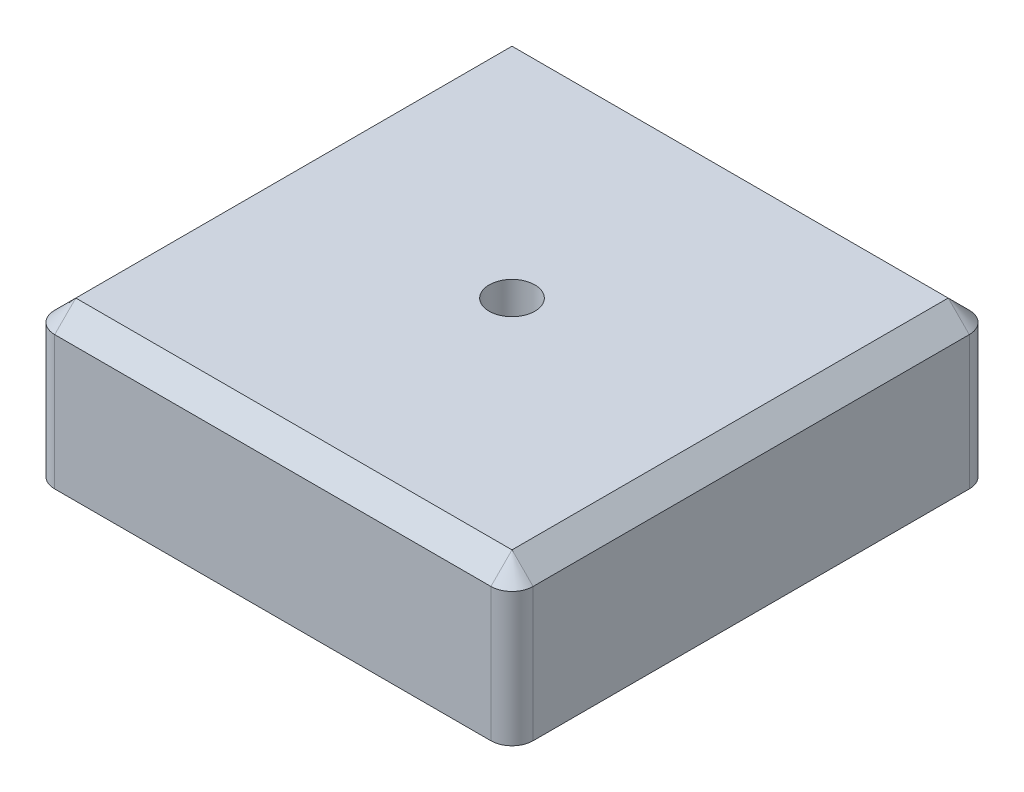
ISO-10303-21;
HEADER;
FILE_DESCRIPTION(('STEP AP214'),'2;1');
FILE_NAME('part.step','',(''),(''),'','','');
FILE_SCHEMA(('AUTOMOTIVE_DESIGN { 1 0 10303 214 1 1 1 1 }'));
ENDSEC;
DATA;
#1=APPLICATION_CONTEXT('core data for automotive mechanical design processes');
#2=APPLICATION_PROTOCOL_DEFINITION('international standard','automotive_design',2000,#1);
#3=PRODUCT_CONTEXT('',#1,'mechanical');
#4=PRODUCT('Part','Part','',(#3));
#5=PRODUCT_RELATED_PRODUCT_CATEGORY('part','',(#4));
#6=PRODUCT_DEFINITION_FORMATION('','',#4);
#7=PRODUCT_DEFINITION_CONTEXT('part definition',#1,'design');
#8=PRODUCT_DEFINITION('design','',#6,#7);
#9=PRODUCT_DEFINITION_SHAPE('','',#8);
#10=(LENGTH_UNIT() NAMED_UNIT(*) SI_UNIT(.MILLI.,.METRE.));
#11=(NAMED_UNIT(*) PLANE_ANGLE_UNIT() SI_UNIT($,.RADIAN.));
#12=(NAMED_UNIT(*) SI_UNIT($,.STERADIAN.) SOLID_ANGLE_UNIT());
#13=UNCERTAINTY_MEASURE_WITH_UNIT(LENGTH_MEASURE(1.E-05),#10,'distance_accuracy_value','');
#14=(GEOMETRIC_REPRESENTATION_CONTEXT(3) GLOBAL_UNCERTAINTY_ASSIGNED_CONTEXT((#13)) GLOBAL_UNIT_ASSIGNED_CONTEXT((#10,
#11,#12)) REPRESENTATION_CONTEXT('',''));
#15=CARTESIAN_POINT('',(0.,0.,0.));
#16=DIRECTION('',(0.,0.,1.));
#17=DIRECTION('',(1.,0.,0.));
#18=AXIS2_PLACEMENT_3D('',#15,#16,#17);
#19=CARTESIAN_POINT('',(34.,10.,-34.));
#20=DIRECTION('',(-1.,0.,0.));
#21=DIRECTION('',(0.,0.,1.));
#22=AXIS2_PLACEMENT_3D('',#19,#20,#21);
#23=PLANE('',#22);
#24=DIRECTION('',(0.,-1.,0.));
#25=VECTOR('',#24,1.);
#26=CARTESIAN_POINT('',(34.,10.,-31.));
#27=LINE('',#26,#25);
#28=CARTESIAN_POINT('',(34.,-12.,-31.));
#29=VERTEX_POINT('',#28);
#30=CARTESIAN_POINT('',(34.,6.99999999999998,-31.));
#31=VERTEX_POINT('',#30);
#32=EDGE_CURVE('E188',#29,#31,#27,.F.);
#33=ORIENTED_EDGE('',*,*,#32,.T.);
#34=DIRECTION('',(0.,0.,1.));
#35=VECTOR('',#34,1.);
#36=CARTESIAN_POINT('',(34.,6.99999999999998,31.));
#37=LINE('',#36,#35);
#38=CARTESIAN_POINT('',(34.,6.99999999999998,31.));
#39=VERTEX_POINT('',#38);
#40=EDGE_CURVE('E260',#31,#39,#37,.T.);
#41=ORIENTED_EDGE('',*,*,#40,.T.);
#42=DIRECTION('',(0.,-1.,0.));
#43=VECTOR('',#42,1.);
#44=CARTESIAN_POINT('',(34.,10.,31.));
#45=LINE('',#44,#43);
#46=CARTESIAN_POINT('',(34.,-12.,31.));
#47=VERTEX_POINT('',#46);
#48=EDGE_CURVE('E190',#39,#47,#45,.T.);
#49=ORIENTED_EDGE('',*,*,#48,.T.);
#50=DIRECTION('',(0.,0.,1.));
#51=VECTOR('',#50,1.);
#52=CARTESIAN_POINT('',(34.,-12.,-34.));
#53=LINE('',#52,#51);
#54=EDGE_CURVE('E177',#29,#47,#53,.T.);
#55=ORIENTED_EDGE('',*,*,#54,.F.);
#56=EDGE_LOOP('',(#33,#41,#49,#55));
#57=FACE_BOUND('',#56,.T.);
#58=ADVANCED_FACE('F34',(#57),#23,.F.);
#59=CARTESIAN_POINT('',(-34.,10.,-34.));
#60=DIRECTION('',(0.,0.,1.));
#61=DIRECTION('',(1.,0.,0.));
#62=AXIS2_PLACEMENT_3D('',#59,#60,#61);
#63=PLANE('',#62);
#64=DIRECTION('',(0.,-1.,0.));
#65=VECTOR('',#64,1.);
#66=CARTESIAN_POINT('',(-31.,10.,-34.));
#67=LINE('',#66,#65);
#68=CARTESIAN_POINT('',(-31.,-12.,-34.));
#69=VERTEX_POINT('',#68);
#70=CARTESIAN_POINT('',(-31.,6.99999999999998,-34.));
#71=VERTEX_POINT('',#70);
#72=EDGE_CURVE('E219',#69,#71,#67,.F.);
#73=ORIENTED_EDGE('',*,*,#72,.T.);
#74=DIRECTION('',(1.,0.,0.));
#75=VECTOR('',#74,1.);
#76=CARTESIAN_POINT('',(31.,6.99999999999998,-34.));
#77=LINE('',#76,#75);
#78=CARTESIAN_POINT('',(31.,6.99999999999998,-34.));
#79=VERTEX_POINT('',#78);
#80=EDGE_CURVE('E264',#71,#79,#77,.T.);
#81=ORIENTED_EDGE('',*,*,#80,.T.);
#82=DIRECTION('',(0.,-1.,0.));
#83=VECTOR('',#82,1.);
#84=CARTESIAN_POINT('',(31.,10.,-34.));
#85=LINE('',#84,#83);
#86=CARTESIAN_POINT('',(31.,-12.,-34.));
#87=VERTEX_POINT('',#86);
#88=EDGE_CURVE('E222',#79,#87,#85,.T.);
#89=ORIENTED_EDGE('',*,*,#88,.T.);
#90=DIRECTION('',(1.,0.,0.));
#91=VECTOR('',#90,1.);
#92=CARTESIAN_POINT('',(-34.,-12.,-34.));
#93=LINE('',#92,#91);
#94=EDGE_CURVE('E179',#69,#87,#93,.T.);
#95=ORIENTED_EDGE('',*,*,#94,.F.);
#96=EDGE_LOOP('',(#73,#81,#89,#95));
#97=FACE_BOUND('',#96,.T.);
#98=ADVANCED_FACE('F427',(#97),#63,.F.);
#99=CARTESIAN_POINT('',(-34.,10.,-34.));
#100=DIRECTION('',(1.,0.,0.));
#101=DIRECTION('',(0.,0.,-1.));
#102=AXIS2_PLACEMENT_3D('',#99,#100,#101);
#103=PLANE('',#102);
#104=DIRECTION('',(0.,-1.,0.));
#105=VECTOR('',#104,1.);
#106=CARTESIAN_POINT('',(-34.,10.,31.));
#107=LINE('',#106,#105);
#108=CARTESIAN_POINT('',(-34.,-12.,31.));
#109=VERTEX_POINT('',#108);
#110=CARTESIAN_POINT('',(-34.,6.99999999999998,31.));
#111=VERTEX_POINT('',#110);
#112=EDGE_CURVE('E216',#109,#111,#107,.F.);
#113=ORIENTED_EDGE('',*,*,#112,.T.);
#114=DIRECTION('',(0.,0.,-1.));
#115=VECTOR('',#114,1.);
#116=CARTESIAN_POINT('',(-34.,6.99999999999998,-31.));
#117=LINE('',#116,#115);
#118=CARTESIAN_POINT('',(-34.,6.99999999999998,-31.));
#119=VERTEX_POINT('',#118);
#120=EDGE_CURVE('E268',#111,#119,#117,.T.);
#121=ORIENTED_EDGE('',*,*,#120,.T.);
#122=DIRECTION('',(0.,-1.,0.));
#123=VECTOR('',#122,1.);
#124=CARTESIAN_POINT('',(-34.,10.,-31.));
#125=LINE('',#124,#123);
#126=CARTESIAN_POINT('',(-34.,-12.,-31.));
#127=VERTEX_POINT('',#126);
#128=EDGE_CURVE('E214',#119,#127,#125,.T.);
#129=ORIENTED_EDGE('',*,*,#128,.T.);
#130=DIRECTION('',(0.,0.,-1.));
#131=VECTOR('',#130,1.);
#132=CARTESIAN_POINT('',(-34.,-12.,34.));
#133=LINE('',#132,#131);
#134=EDGE_CURVE('E198',#109,#127,#133,.T.);
#135=ORIENTED_EDGE('',*,*,#134,.F.);
#136=EDGE_LOOP('',(#113,#121,#129,#135));
#137=FACE_BOUND('',#136,.T.);
#138=ADVANCED_FACE('F421',(#137),#103,.F.);
#139=CARTESIAN_POINT('',(-34.,10.,34.));
#140=DIRECTION('',(0.,0.,-1.));
#141=DIRECTION('',(-1.,0.,0.));
#142=AXIS2_PLACEMENT_3D('',#139,#140,#141);
#143=PLANE('',#142);
#144=DIRECTION('',(0.,-1.,0.));
#145=VECTOR('',#144,1.);
#146=CARTESIAN_POINT('',(31.,10.,34.));
#147=LINE('',#146,#145);
#148=CARTESIAN_POINT('',(31.,-12.,34.));
#149=VERTEX_POINT('',#148);
#150=CARTESIAN_POINT('',(31.,6.99999999999998,34.));
#151=VERTEX_POINT('',#150);
#152=EDGE_CURVE('E211',#149,#151,#147,.F.);
#153=ORIENTED_EDGE('',*,*,#152,.T.);
#154=DIRECTION('',(-1.,0.,0.));
#155=VECTOR('',#154,1.);
#156=CARTESIAN_POINT('',(-31.,6.99999999999998,34.));
#157=LINE('',#156,#155);
#158=CARTESIAN_POINT('',(-31.,6.99999999999998,34.));
#159=VERTEX_POINT('',#158);
#160=EDGE_CURVE('E272',#151,#159,#157,.T.);
#161=ORIENTED_EDGE('',*,*,#160,.T.);
#162=DIRECTION('',(0.,-1.,0.));
#163=VECTOR('',#162,1.);
#164=CARTESIAN_POINT('',(-31.,10.,34.));
#165=LINE('',#164,#163);
#166=CARTESIAN_POINT('',(-31.,-12.,34.));
#167=VERTEX_POINT('',#166);
#168=EDGE_CURVE('E209',#159,#167,#165,.T.);
#169=ORIENTED_EDGE('',*,*,#168,.T.);
#170=DIRECTION('',(-1.,0.,0.));
#171=VECTOR('',#170,1.);
#172=CARTESIAN_POINT('',(34.,-12.,34.));
#173=LINE('',#172,#171);
#174=EDGE_CURVE('E192',#149,#167,#173,.T.);
#175=ORIENTED_EDGE('',*,*,#174,.F.);
#176=EDGE_LOOP('',(#153,#161,#169,#175));
#177=FACE_BOUND('',#176,.T.);
#178=ADVANCED_FACE('F383',(#177),#143,.F.);
#179=CARTESIAN_POINT('',(0.,10.,0.));
#180=DIRECTION('',(0.,1.,0.));
#181=DIRECTION('',(0.,0.,1.));
#182=AXIS2_PLACEMENT_3D('',#179,#180,#181);
#183=PLANE('',#182);
#184=DIRECTION('',(1.,0.,0.));
#185=VECTOR('',#184,1.);
#186=CARTESIAN_POINT('',(31.,10.,31.));
#187=LINE('',#186,#185);
#188=CARTESIAN_POINT('',(-31.,10.,31.));
#189=VERTEX_POINT('',#188);
#190=CARTESIAN_POINT('',(31.,10.,31.));
#191=VERTEX_POINT('',#190);
#192=EDGE_CURVE('E251',#189,#191,#187,.T.);
#193=ORIENTED_EDGE('',*,*,#192,.T.);
#194=DIRECTION('',(0.,0.,-1.));
#195=VECTOR('',#194,1.);
#196=CARTESIAN_POINT('',(31.,10.,-31.));
#197=LINE('',#196,#195);
#198=CARTESIAN_POINT('',(31.,10.,-31.));
#199=VERTEX_POINT('',#198);
#200=EDGE_CURVE('E257',#191,#199,#197,.T.);
#201=ORIENTED_EDGE('',*,*,#200,.T.);
#202=DIRECTION('',(-1.,0.,0.));
#203=VECTOR('',#202,1.);
#204=CARTESIAN_POINT('',(-31.,10.,-31.));
#205=LINE('',#204,#203);
#206=CARTESIAN_POINT('',(-31.,10.,-31.));
#207=VERTEX_POINT('',#206);
#208=EDGE_CURVE('E255',#199,#207,#205,.T.);
#209=ORIENTED_EDGE('',*,*,#208,.T.);
#210=DIRECTION('',(0.,0.,1.));
#211=VECTOR('',#210,1.);
#212=CARTESIAN_POINT('',(-31.,10.,31.));
#213=LINE('',#212,#211);
#214=EDGE_CURVE('E253',#207,#189,#213,.T.);
#215=ORIENTED_EDGE('',*,*,#214,.T.);
#216=EDGE_LOOP('',(#193,#201,#209,#215));
#217=FACE_BOUND('',#216,.T.);
#218=CARTESIAN_POINT('',(0.,10.,0.));
#219=DIRECTION('',(0.,1.,0.));
#220=DIRECTION('',(0.,0.,1.));
#221=AXIS2_PLACEMENT_3D('',#218,#219,#220);
#222=CIRCLE('',#221,3.25);
#223=CARTESIAN_POINT('',(0.,10.,3.25));
#224=VERTEX_POINT('',#223);
#225=EDGE_CURVE('E763',#224,#224,#222,.T.);
#226=ORIENTED_EDGE('',*,*,#225,.F.);
#227=EDGE_LOOP('',(#226));
#228=FACE_BOUND('',#227,.T.);
#229=ADVANCED_FACE('F400',(#217,#228),#183,.T.);
#230=CARTESIAN_POINT('',(0.,-12.,0.));
#231=DIRECTION('',(0.,-1.,0.));
#232=DIRECTION('',(0.,0.,-1.));
#233=AXIS2_PLACEMENT_3D('',#230,#231,#232);
#234=PLANE('',#233);
#235=ORIENTED_EDGE('',*,*,#54,.T.);
#236=CARTESIAN_POINT('',(31.,-12.,31.));
#237=DIRECTION('',(0.,-1.,0.));
#238=DIRECTION('',(0.,0.,-1.));
#239=AXIS2_PLACEMENT_3D('',#236,#237,#238);
#240=CIRCLE('',#239,3.);
#241=EDGE_CURVE('E207',#47,#149,#240,.T.);
#242=ORIENTED_EDGE('',*,*,#241,.T.);
#243=ORIENTED_EDGE('',*,*,#174,.T.);
#244=CARTESIAN_POINT('',(-31.,-12.,31.));
#245=DIRECTION('',(0.,-1.,0.));
#246=DIRECTION('',(0.,0.,-1.));
#247=AXIS2_PLACEMENT_3D('',#244,#245,#246);
#248=CIRCLE('',#247,3.);
#249=EDGE_CURVE('E183',#167,#109,#248,.T.);
#250=ORIENTED_EDGE('',*,*,#249,.T.);
#251=ORIENTED_EDGE('',*,*,#134,.T.);
#252=CARTESIAN_POINT('',(-31.,-12.,-31.));
#253=DIRECTION('',(0.,-1.,0.));
#254=DIRECTION('',(0.,0.,-1.));
#255=AXIS2_PLACEMENT_3D('',#252,#253,#254);
#256=CIRCLE('',#255,3.);
#257=EDGE_CURVE('E184',#127,#69,#256,.T.);
#258=ORIENTED_EDGE('',*,*,#257,.T.);
#259=ORIENTED_EDGE('',*,*,#94,.T.);
#260=CARTESIAN_POINT('',(31.,-12.,-31.));
#261=DIRECTION('',(0.,-1.,0.));
#262=DIRECTION('',(0.,0.,-1.));
#263=AXIS2_PLACEMENT_3D('',#260,#261,#262);
#264=CIRCLE('',#263,3.);
#265=EDGE_CURVE('E173',#87,#29,#264,.T.);
#266=ORIENTED_EDGE('',*,*,#265,.T.);
#267=EDGE_LOOP('',(#235,#242,#243,#250,#251,#258,#259,#266));
#268=FACE_BOUND('',#267,.T.);
#269=DIRECTION('',(-1.,0.,0.));
#270=VECTOR('',#269,1.);
#271=CARTESIAN_POINT('',(-15.,-12.,15.));
#272=LINE('',#271,#270);
#273=CARTESIAN_POINT('',(12.,-12.,15.));
#274=VERTEX_POINT('',#273);
#275=CARTESIAN_POINT('',(-12.,-12.,15.));
#276=VERTEX_POINT('',#275);
#277=EDGE_CURVE('E374',#274,#276,#272,.T.);
#278=ORIENTED_EDGE('',*,*,#277,.F.);
#279=CARTESIAN_POINT('',(12.,-12.,12.));
#280=DIRECTION('',(0.,-1.,0.));
#281=DIRECTION('',(0.,0.,-1.));
#282=AXIS2_PLACEMENT_3D('',#279,#280,#281);
#283=CIRCLE('',#282,3.);
#284=CARTESIAN_POINT('',(15.,-12.,12.));
#285=VERTEX_POINT('',#284);
#286=EDGE_CURVE('E248',#274,#285,#283,.F.);
#287=ORIENTED_EDGE('',*,*,#286,.T.);
#288=DIRECTION('',(0.,0.,1.));
#289=VECTOR('',#288,1.);
#290=CARTESIAN_POINT('',(15.,-12.,15.));
#291=LINE('',#290,#289);
#292=CARTESIAN_POINT('',(15.,-12.,-12.));
#293=VERTEX_POINT('',#292);
#294=EDGE_CURVE('E365',#293,#285,#291,.T.);
#295=ORIENTED_EDGE('',*,*,#294,.F.);
#296=CARTESIAN_POINT('',(12.,-12.,-12.));
#297=DIRECTION('',(0.,-1.,0.));
#298=DIRECTION('',(0.,0.,-1.));
#299=AXIS2_PLACEMENT_3D('',#296,#297,#298);
#300=CIRCLE('',#299,3.);
#301=CARTESIAN_POINT('',(12.,-12.,-15.));
#302=VERTEX_POINT('',#301);
#303=EDGE_CURVE('E246',#293,#302,#300,.F.);
#304=ORIENTED_EDGE('',*,*,#303,.T.);
#305=DIRECTION('',(1.,0.,0.));
#306=VECTOR('',#305,1.);
#307=CARTESIAN_POINT('',(-15.,-12.,-15.));
#308=LINE('',#307,#306);
#309=CARTESIAN_POINT('',(-12.,-12.,-15.));
#310=VERTEX_POINT('',#309);
#311=EDGE_CURVE('E363',#310,#302,#308,.T.);
#312=ORIENTED_EDGE('',*,*,#311,.F.);
#313=CARTESIAN_POINT('',(-12.,-12.,-12.));
#314=DIRECTION('',(0.,-1.,0.));
#315=DIRECTION('',(0.,0.,-1.));
#316=AXIS2_PLACEMENT_3D('',#313,#314,#315);
#317=CIRCLE('',#316,3.);
#318=CARTESIAN_POINT('',(-15.,-12.,-12.));
#319=VERTEX_POINT('',#318);
#320=EDGE_CURVE('E244',#310,#319,#317,.F.);
#321=ORIENTED_EDGE('',*,*,#320,.T.);
#322=DIRECTION('',(0.,0.,-1.));
#323=VECTOR('',#322,1.);
#324=CARTESIAN_POINT('',(-15.,-12.,15.));
#325=LINE('',#324,#323);
#326=CARTESIAN_POINT('',(-15.,-12.,12.));
#327=VERTEX_POINT('',#326);
#328=EDGE_CURVE('E370',#327,#319,#325,.T.);
#329=ORIENTED_EDGE('',*,*,#328,.F.);
#330=CARTESIAN_POINT('',(-12.,-12.,12.));
#331=DIRECTION('',(0.,-1.,0.));
#332=DIRECTION('',(0.,0.,-1.));
#333=AXIS2_PLACEMENT_3D('',#330,#331,#332);
#334=CIRCLE('',#333,3.);
#335=EDGE_CURVE('E242',#327,#276,#334,.F.);
#336=ORIENTED_EDGE('',*,*,#335,.T.);
#337=EDGE_LOOP('',(#278,#287,#295,#304,#312,#321,#329,#336));
#338=FACE_BOUND('',#337,.T.);
#339=ADVANCED_FACE('F175',(#268,#338),#234,.T.);
#340=CARTESIAN_POINT('',(15.,-12.,15.));
#341=DIRECTION('',(-1.,0.,0.));
#342=DIRECTION('',(0.,0.,1.));
#343=AXIS2_PLACEMENT_3D('',#340,#341,#342);
#344=PLANE('',#343);
#345=DIRECTION('',(0.,1.,0.));
#346=VECTOR('',#345,1.);
#347=CARTESIAN_POINT('',(15.,0.,12.));
#348=LINE('',#347,#346);
#349=CARTESIAN_POINT('',(15.,-2.99999999999998,12.));
#350=VERTEX_POINT('',#349);
#351=EDGE_CURVE('E238',#285,#350,#348,.T.);
#352=ORIENTED_EDGE('',*,*,#351,.T.);
#353=DIRECTION('',(0.,0.,-1.));
#354=VECTOR('',#353,1.);
#355=CARTESIAN_POINT('',(15.,-2.99999999999998,15.));
#356=LINE('',#355,#354);
#357=CARTESIAN_POINT('',(15.,-2.99999999999998,-12.));
#358=VERTEX_POINT('',#357);
#359=EDGE_CURVE('E317',#350,#358,#356,.T.);
#360=ORIENTED_EDGE('',*,*,#359,.T.);
#361=DIRECTION('',(0.,1.,0.));
#362=VECTOR('',#361,1.);
#363=CARTESIAN_POINT('',(15.,-12.,-12.));
#364=LINE('',#363,#362);
#365=EDGE_CURVE('E240',#358,#293,#364,.F.);
#366=ORIENTED_EDGE('',*,*,#365,.T.);
#367=ORIENTED_EDGE('',*,*,#294,.T.);
#368=EDGE_LOOP('',(#352,#360,#366,#367));
#369=FACE_BOUND('',#368,.T.);
#370=ADVANCED_FACE('F353',(#369),#344,.T.);
#371=CARTESIAN_POINT('',(-15.,-12.,15.));
#372=DIRECTION('',(0.,0.,-1.));
#373=DIRECTION('',(-1.,0.,0.));
#374=AXIS2_PLACEMENT_3D('',#371,#372,#373);
#375=PLANE('',#374);
#376=DIRECTION('',(0.,1.,0.));
#377=VECTOR('',#376,1.);
#378=CARTESIAN_POINT('',(-12.,0.,15.));
#379=LINE('',#378,#377);
#380=CARTESIAN_POINT('',(-12.,-2.99999999999998,15.));
#381=VERTEX_POINT('',#380);
#382=EDGE_CURVE('E226',#276,#381,#379,.T.);
#383=ORIENTED_EDGE('',*,*,#382,.T.);
#384=DIRECTION('',(1.,0.,0.));
#385=VECTOR('',#384,1.);
#386=CARTESIAN_POINT('',(-15.,-2.99999999999998,15.));
#387=LINE('',#386,#385);
#388=CARTESIAN_POINT('',(12.,-2.99999999999998,15.));
#389=VERTEX_POINT('',#388);
#390=EDGE_CURVE('E43',#381,#389,#387,.T.);
#391=ORIENTED_EDGE('',*,*,#390,.T.);
#392=DIRECTION('',(0.,1.,0.));
#393=VECTOR('',#392,1.);
#394=CARTESIAN_POINT('',(12.,-12.,15.));
#395=LINE('',#394,#393);
#396=EDGE_CURVE('E224',#389,#274,#395,.F.);
#397=ORIENTED_EDGE('',*,*,#396,.T.);
#398=ORIENTED_EDGE('',*,*,#277,.T.);
#399=EDGE_LOOP('',(#383,#391,#397,#398));
#400=FACE_BOUND('',#399,.T.);
#401=ADVANCED_FACE('F665',(#400),#375,.T.);
#402=CARTESIAN_POINT('',(-15.,-12.,15.));
#403=DIRECTION('',(1.,0.,0.));
#404=DIRECTION('',(0.,0.,-1.));
#405=AXIS2_PLACEMENT_3D('',#402,#403,#404);
#406=PLANE('',#405);
#407=DIRECTION('',(0.,1.,0.));
#408=VECTOR('',#407,1.);
#409=CARTESIAN_POINT('',(-15.,0.,-12.));
#410=LINE('',#409,#408);
#411=CARTESIAN_POINT('',(-15.,-2.99999999999998,-12.));
#412=VERTEX_POINT('',#411);
#413=EDGE_CURVE('E228',#319,#412,#410,.T.);
#414=ORIENTED_EDGE('',*,*,#413,.T.);
#415=DIRECTION('',(0.,0.,1.));
#416=VECTOR('',#415,1.);
#417=CARTESIAN_POINT('',(-15.,-2.99999999999998,15.));
#418=LINE('',#417,#416);
#419=CARTESIAN_POINT('',(-15.,-2.99999999999998,12.));
#420=VERTEX_POINT('',#419);
#421=EDGE_CURVE('E311',#412,#420,#418,.T.);
#422=ORIENTED_EDGE('',*,*,#421,.T.);
#423=DIRECTION('',(0.,1.,0.));
#424=VECTOR('',#423,1.);
#425=CARTESIAN_POINT('',(-15.,-12.,12.));
#426=LINE('',#425,#424);
#427=EDGE_CURVE('E231',#420,#327,#426,.F.);
#428=ORIENTED_EDGE('',*,*,#427,.T.);
#429=ORIENTED_EDGE('',*,*,#328,.T.);
#430=EDGE_LOOP('',(#414,#422,#428,#429));
#431=FACE_BOUND('',#430,.T.);
#432=ADVANCED_FACE('F657',(#431),#406,.T.);
#433=CARTESIAN_POINT('',(-15.,-12.,-15.));
#434=DIRECTION('',(0.,0.,1.));
#435=DIRECTION('',(1.,0.,0.));
#436=AXIS2_PLACEMENT_3D('',#433,#434,#435);
#437=PLANE('',#436);
#438=DIRECTION('',(0.,1.,0.));
#439=VECTOR('',#438,1.);
#440=CARTESIAN_POINT('',(12.,0.,-15.));
#441=LINE('',#440,#439);
#442=CARTESIAN_POINT('',(12.,-2.99999999999998,-15.));
#443=VERTEX_POINT('',#442);
#444=EDGE_CURVE('E233',#302,#443,#441,.T.);
#445=ORIENTED_EDGE('',*,*,#444,.T.);
#446=DIRECTION('',(-1.,0.,0.));
#447=VECTOR('',#446,1.);
#448=CARTESIAN_POINT('',(-15.,-2.99999999999998,-15.));
#449=LINE('',#448,#447);
#450=CARTESIAN_POINT('',(-12.,-2.99999999999998,-15.));
#451=VERTEX_POINT('',#450);
#452=EDGE_CURVE('E309',#443,#451,#449,.T.);
#453=ORIENTED_EDGE('',*,*,#452,.T.);
#454=DIRECTION('',(0.,1.,0.));
#455=VECTOR('',#454,1.);
#456=CARTESIAN_POINT('',(-12.,-12.,-15.));
#457=LINE('',#456,#455);
#458=EDGE_CURVE('E236',#451,#310,#457,.F.);
#459=ORIENTED_EDGE('',*,*,#458,.T.);
#460=ORIENTED_EDGE('',*,*,#311,.T.);
#461=EDGE_LOOP('',(#445,#453,#459,#460));
#462=FACE_BOUND('',#461,.T.);
#463=ADVANCED_FACE('F367',(#462),#437,.T.);
#464=CARTESIAN_POINT('',(0.,0.,0.));
#465=DIRECTION('',(0.,1.,0.));
#466=DIRECTION('',(0.,0.,1.));
#467=AXIS2_PLACEMENT_3D('',#464,#465,#466);
#468=PLANE('',#467);
#469=DIRECTION('',(0.,0.,-1.));
#470=VECTOR('',#469,1.);
#471=CARTESIAN_POINT('',(-12.,0.,0.));
#472=LINE('',#471,#470);
#473=CARTESIAN_POINT('',(-12.,0.,12.));
#474=VERTEX_POINT('',#473);
#475=CARTESIAN_POINT('',(-12.,0.,-12.));
#476=VERTEX_POINT('',#475);
#477=EDGE_CURVE('E304',#474,#476,#472,.T.);
#478=ORIENTED_EDGE('',*,*,#477,.T.);
#479=DIRECTION('',(1.,0.,0.));
#480=VECTOR('',#479,1.);
#481=CARTESIAN_POINT('',(0.,0.,-12.));
#482=LINE('',#481,#480);
#483=CARTESIAN_POINT('',(12.,0.,-12.));
#484=VERTEX_POINT('',#483);
#485=EDGE_CURVE('E306',#476,#484,#482,.T.);
#486=ORIENTED_EDGE('',*,*,#485,.T.);
#487=DIRECTION('',(0.,0.,1.));
#488=VECTOR('',#487,1.);
#489=CARTESIAN_POINT('',(12.,0.,0.));
#490=LINE('',#489,#488);
#491=CARTESIAN_POINT('',(12.,0.,12.));
#492=VERTEX_POINT('',#491);
#493=EDGE_CURVE('E302',#484,#492,#490,.T.);
#494=ORIENTED_EDGE('',*,*,#493,.T.);
#495=DIRECTION('',(-1.,0.,0.));
#496=VECTOR('',#495,1.);
#497=CARTESIAN_POINT('',(0.,0.,12.));
#498=LINE('',#497,#496);
#499=EDGE_CURVE('E300',#492,#474,#498,.T.);
#500=ORIENTED_EDGE('',*,*,#499,.T.);
#501=EDGE_LOOP('',(#478,#486,#494,#500));
#502=FACE_BOUND('',#501,.T.);
#503=CARTESIAN_POINT('',(0.,0.,0.));
#504=DIRECTION('',(0.,-1.,0.));
#505=DIRECTION('',(0.,0.,-1.));
#506=AXIS2_PLACEMENT_3D('',#503,#504,#505);
#507=CIRCLE('',#506,3.25);
#508=CARTESIAN_POINT('',(0.,0.,-3.25));
#509=VERTEX_POINT('',#508);
#510=EDGE_CURVE('E297',#509,#509,#507,.T.);
#511=ORIENTED_EDGE('',*,*,#510,.F.);
#512=EDGE_LOOP('',(#511));
#513=FACE_BOUND('',#512,.T.);
#514=ADVANCED_FACE('F455',(#502,#513),#468,.F.);
#515=CARTESIAN_POINT('',(31.,10.,31.));
#516=DIRECTION('',(0.,-1.,0.));
#517=DIRECTION('',(0.,0.,-1.));
#518=AXIS2_PLACEMENT_3D('',#515,#516,#517);
#519=CYLINDRICAL_SURFACE('',#518,3.);
#520=ORIENTED_EDGE('',*,*,#48,.F.);
#521=CARTESIAN_POINT('',(31.,6.99999999999998,31.));
#522=DIRECTION('',(0.,1.,0.));
#523=DIRECTION('',(0.,0.,1.));
#524=AXIS2_PLACEMENT_3D('',#521,#522,#523);
#525=CIRCLE('',#524,3.);
#526=EDGE_CURVE('E262',#39,#151,#525,.F.);
#527=ORIENTED_EDGE('',*,*,#526,.T.);
#528=ORIENTED_EDGE('',*,*,#152,.F.);
#529=ORIENTED_EDGE('',*,*,#241,.F.);
#530=EDGE_LOOP('',(#520,#527,#528,#529));
#531=FACE_BOUND('',#530,.T.);
#532=ADVANCED_FACE('F387',(#531),#519,.T.);
#533=CARTESIAN_POINT('',(-31.,10.,31.));
#534=DIRECTION('',(0.,-1.,0.));
#535=DIRECTION('',(0.,0.,-1.));
#536=AXIS2_PLACEMENT_3D('',#533,#534,#535);
#537=CYLINDRICAL_SURFACE('',#536,3.);
#538=ORIENTED_EDGE('',*,*,#168,.F.);
#539=CARTESIAN_POINT('',(-31.,6.99999999999998,31.));
#540=DIRECTION('',(0.,1.,0.));
#541=DIRECTION('',(0.,0.,1.));
#542=AXIS2_PLACEMENT_3D('',#539,#540,#541);
#543=CIRCLE('',#542,3.);
#544=EDGE_CURVE('E270',#159,#111,#543,.F.);
#545=ORIENTED_EDGE('',*,*,#544,.T.);
#546=ORIENTED_EDGE('',*,*,#112,.F.);
#547=ORIENTED_EDGE('',*,*,#249,.F.);
#548=EDGE_LOOP('',(#538,#545,#546,#547));
#549=FACE_BOUND('',#548,.T.);
#550=ADVANCED_FACE('F409',(#549),#537,.T.);
#551=CARTESIAN_POINT('',(31.,10.,-31.));
#552=DIRECTION('',(0.,-1.,0.));
#553=DIRECTION('',(0.,0.,-1.));
#554=AXIS2_PLACEMENT_3D('',#551,#552,#553);
#555=CYLINDRICAL_SURFACE('',#554,3.);
#556=ORIENTED_EDGE('',*,*,#88,.F.);
#557=CARTESIAN_POINT('',(31.,6.99999999999998,-31.));
#558=DIRECTION('',(0.,1.,0.));
#559=DIRECTION('',(0.,0.,1.));
#560=AXIS2_PLACEMENT_3D('',#557,#558,#559);
#561=CIRCLE('',#560,3.);
#562=EDGE_CURVE('E197',#79,#31,#561,.F.);
#563=ORIENTED_EDGE('',*,*,#562,.T.);
#564=ORIENTED_EDGE('',*,*,#32,.F.);
#565=ORIENTED_EDGE('',*,*,#265,.F.);
#566=EDGE_LOOP('',(#556,#563,#564,#565));
#567=FACE_BOUND('',#566,.T.);
#568=ADVANCED_FACE('F195',(#567),#555,.T.);
#569=CARTESIAN_POINT('',(-31.,10.,-31.));
#570=DIRECTION('',(0.,-1.,0.));
#571=DIRECTION('',(0.,0.,-1.));
#572=AXIS2_PLACEMENT_3D('',#569,#570,#571);
#573=CYLINDRICAL_SURFACE('',#572,3.);
#574=ORIENTED_EDGE('',*,*,#128,.F.);
#575=CARTESIAN_POINT('',(-31.,6.99999999999998,-31.));
#576=DIRECTION('',(0.,1.,0.));
#577=DIRECTION('',(0.,0.,1.));
#578=AXIS2_PLACEMENT_3D('',#575,#576,#577);
#579=CIRCLE('',#578,3.);
#580=EDGE_CURVE('E266',#119,#71,#579,.F.);
#581=ORIENTED_EDGE('',*,*,#580,.T.);
#582=ORIENTED_EDGE('',*,*,#72,.F.);
#583=ORIENTED_EDGE('',*,*,#257,.F.);
#584=EDGE_LOOP('',(#574,#581,#582,#583));
#585=FACE_BOUND('',#584,.T.);
#586=ADVANCED_FACE('F424',(#585),#573,.T.);
#587=CARTESIAN_POINT('',(-12.,-12.,12.));
#588=DIRECTION('',(0.,-1.,0.));
#589=DIRECTION('',(0.,0.,-1.));
#590=AXIS2_PLACEMENT_3D('',#587,#588,#589);
#591=CYLINDRICAL_SURFACE('',#590,3.);
#592=ORIENTED_EDGE('',*,*,#427,.F.);
#593=CARTESIAN_POINT('',(-12.,-2.99999999999998,12.));
#594=DIRECTION('',(0.,1.,0.));
#595=DIRECTION('',(0.,0.,1.));
#596=AXIS2_PLACEMENT_3D('',#593,#594,#595);
#597=CIRCLE('',#596,3.);
#598=EDGE_CURVE('E315',#420,#381,#597,.T.);
#599=ORIENTED_EDGE('',*,*,#598,.T.);
#600=ORIENTED_EDGE('',*,*,#382,.F.);
#601=ORIENTED_EDGE('',*,*,#335,.F.);
#602=EDGE_LOOP('',(#592,#599,#600,#601));
#603=FACE_BOUND('',#602,.T.);
#604=ADVANCED_FACE('F462',(#603),#591,.F.);
#605=CARTESIAN_POINT('',(-12.,-12.,-12.));
#606=DIRECTION('',(0.,-1.,0.));
#607=DIRECTION('',(0.,0.,-1.));
#608=AXIS2_PLACEMENT_3D('',#605,#606,#607);
#609=CYLINDRICAL_SURFACE('',#608,3.);
#610=ORIENTED_EDGE('',*,*,#458,.F.);
#611=CARTESIAN_POINT('',(-12.,-2.99999999999998,-12.));
#612=DIRECTION('',(0.,1.,0.));
#613=DIRECTION('',(0.,0.,1.));
#614=AXIS2_PLACEMENT_3D('',#611,#612,#613);
#615=CIRCLE('',#614,3.);
#616=EDGE_CURVE('E274',#451,#412,#615,.T.);
#617=ORIENTED_EDGE('',*,*,#616,.T.);
#618=ORIENTED_EDGE('',*,*,#413,.F.);
#619=ORIENTED_EDGE('',*,*,#320,.F.);
#620=EDGE_LOOP('',(#610,#617,#618,#619));
#621=FACE_BOUND('',#620,.T.);
#622=ADVANCED_FACE('F465',(#621),#609,.F.);
#623=CARTESIAN_POINT('',(12.,-12.,-12.));
#624=DIRECTION('',(0.,-1.,0.));
#625=DIRECTION('',(0.,0.,-1.));
#626=AXIS2_PLACEMENT_3D('',#623,#624,#625);
#627=CYLINDRICAL_SURFACE('',#626,3.);
#628=ORIENTED_EDGE('',*,*,#365,.F.);
#629=CARTESIAN_POINT('',(12.,-2.99999999999998,-12.));
#630=DIRECTION('',(0.,1.,0.));
#631=DIRECTION('',(0.,0.,1.));
#632=AXIS2_PLACEMENT_3D('',#629,#630,#631);
#633=CIRCLE('',#632,3.);
#634=EDGE_CURVE('E313',#358,#443,#633,.T.);
#635=ORIENTED_EDGE('',*,*,#634,.T.);
#636=ORIENTED_EDGE('',*,*,#444,.F.);
#637=ORIENTED_EDGE('',*,*,#303,.F.);
#638=EDGE_LOOP('',(#628,#635,#636,#637));
#639=FACE_BOUND('',#638,.T.);
#640=ADVANCED_FACE('F358',(#639),#627,.F.);
#641=CARTESIAN_POINT('',(12.,-12.,12.));
#642=DIRECTION('',(0.,-1.,0.));
#643=DIRECTION('',(0.,0.,-1.));
#644=AXIS2_PLACEMENT_3D('',#641,#642,#643);
#645=CYLINDRICAL_SURFACE('',#644,3.);
#646=ORIENTED_EDGE('',*,*,#396,.F.);
#647=CARTESIAN_POINT('',(12.,-2.99999999999998,12.));
#648=DIRECTION('',(0.,1.,0.));
#649=DIRECTION('',(0.,0.,1.));
#650=AXIS2_PLACEMENT_3D('',#647,#648,#649);
#651=CIRCLE('',#650,3.);
#652=EDGE_CURVE('E11',#389,#350,#651,.T.);
#653=ORIENTED_EDGE('',*,*,#652,.T.);
#654=ORIENTED_EDGE('',*,*,#351,.F.);
#655=ORIENTED_EDGE('',*,*,#286,.F.);
#656=EDGE_LOOP('',(#646,#653,#654,#655));
#657=FACE_BOUND('',#656,.T.);
#658=ADVANCED_FACE('F472',(#657),#645,.F.);
#659=CARTESIAN_POINT('',(0.,20.,0.));
#660=DIRECTION('',(0.,-1.,0.));
#661=DIRECTION('',(0.,0.,-1.));
#662=AXIS2_PLACEMENT_3D('',#659,#660,#661);
#663=CYLINDRICAL_SURFACE('',#662,3.25);
#664=ORIENTED_EDGE('',*,*,#225,.T.);
#665=EDGE_LOOP('',(#664));
#666=FACE_BOUND('',#665,.T.);
#667=ORIENTED_EDGE('',*,*,#510,.T.);
#668=EDGE_LOOP('',(#667));
#669=FACE_BOUND('',#668,.T.);
#670=ADVANCED_FACE('F475',(#666,#669),#663,.F.);
#671=CARTESIAN_POINT('',(-31.,6.99999999999998,31.));
#672=DIRECTION('',(0.,-1.,0.));
#673=DIRECTION('',(0.,0.,-1.));
#674=AXIS2_PLACEMENT_3D('',#671,#672,#673);
#675=CONICAL_SURFACE('',#674,3.,0.785398163397446);
#676=DIRECTION('',(0.707106781186546,0.707106781186549,0.));
#677=VECTOR('',#676,1.);
#678=CARTESIAN_POINT('',(-34.,6.99999999999998,31.));
#679=LINE('',#678,#677);
#680=EDGE_CURVE('E291',#111,#189,#679,.T.);
#681=ORIENTED_EDGE('',*,*,#680,.F.);
#682=ORIENTED_EDGE('',*,*,#544,.F.);
#683=DIRECTION('',(0.,-0.707106781186549,0.707106781186546));
#684=VECTOR('',#683,1.);
#685=CARTESIAN_POINT('',(-31.,10.,31.));
#686=LINE('',#685,#684);
#687=EDGE_CURVE('E294',#189,#159,#686,.T.);
#688=ORIENTED_EDGE('',*,*,#687,.F.);
#689=EDGE_LOOP('',(#681,#682,#688));
#690=FACE_BOUND('',#689,.T.);
#691=ADVANCED_FACE('F413',(#690),#675,.T.);
#692=CARTESIAN_POINT('',(0.,10.,31.));
#693=DIRECTION('',(0.,0.707106781186546,0.707106781186549));
#694=DIRECTION('',(-1.,0.,0.));
#695=AXIS2_PLACEMENT_3D('',#692,#693,#694);
#696=PLANE('',#695);
#697=ORIENTED_EDGE('',*,*,#687,.T.);
#698=ORIENTED_EDGE('',*,*,#160,.F.);
#699=DIRECTION('',(0.,-0.707106781186549,0.707106781186546));
#700=VECTOR('',#699,1.);
#701=CARTESIAN_POINT('',(31.,10.,31.));
#702=LINE('',#701,#700);
#703=EDGE_CURVE('E288',#191,#151,#702,.T.);
#704=ORIENTED_EDGE('',*,*,#703,.F.);
#705=ORIENTED_EDGE('',*,*,#192,.F.);
#706=EDGE_LOOP('',(#697,#698,#704,#705));
#707=FACE_BOUND('',#706,.T.);
#708=ADVANCED_FACE('F405',(#707),#696,.T.);
#709=CARTESIAN_POINT('',(-31.,10.,0.));
#710=DIRECTION('',(-0.707106781186549,0.707106781186546,0.));
#711=DIRECTION('',(0.,0.,-1.));
#712=AXIS2_PLACEMENT_3D('',#709,#710,#711);
#713=PLANE('',#712);
#714=ORIENTED_EDGE('',*,*,#680,.T.);
#715=ORIENTED_EDGE('',*,*,#214,.F.);
#716=DIRECTION('',(0.707106781186546,0.707106781186549,0.));
#717=VECTOR('',#716,1.);
#718=CARTESIAN_POINT('',(-34.,6.99999999999998,-31.));
#719=LINE('',#718,#717);
#720=EDGE_CURVE('E285',#119,#207,#719,.T.);
#721=ORIENTED_EDGE('',*,*,#720,.F.);
#722=ORIENTED_EDGE('',*,*,#120,.F.);
#723=EDGE_LOOP('',(#714,#715,#721,#722));
#724=FACE_BOUND('',#723,.T.);
#725=ADVANCED_FACE('F417',(#724),#713,.T.);
#726=CARTESIAN_POINT('',(31.,6.99999999999998,31.));
#727=DIRECTION('',(0.,-1.,0.));
#728=DIRECTION('',(0.,0.,-1.));
#729=AXIS2_PLACEMENT_3D('',#726,#727,#728);
#730=CONICAL_SURFACE('',#729,3.,0.785398163397446);
#731=ORIENTED_EDGE('',*,*,#703,.T.);
#732=ORIENTED_EDGE('',*,*,#526,.F.);
#733=DIRECTION('',(0.707106781186546,-0.707106781186549,0.));
#734=VECTOR('',#733,1.);
#735=CARTESIAN_POINT('',(31.,10.,31.));
#736=LINE('',#735,#734);
#737=EDGE_CURVE('E282',#191,#39,#736,.T.);
#738=ORIENTED_EDGE('',*,*,#737,.F.);
#739=EDGE_LOOP('',(#731,#732,#738));
#740=FACE_BOUND('',#739,.T.);
#741=ADVANCED_FACE('F391',(#740),#730,.T.);
#742=CARTESIAN_POINT('',(-31.,6.99999999999998,-31.));
#743=DIRECTION('',(0.,-1.,0.));
#744=DIRECTION('',(0.,0.,-1.));
#745=AXIS2_PLACEMENT_3D('',#742,#743,#744);
#746=CONICAL_SURFACE('',#745,3.,0.785398163397446);
#747=ORIENTED_EDGE('',*,*,#580,.F.);
#748=ORIENTED_EDGE('',*,*,#720,.T.);
#749=DIRECTION('',(0.,0.707106781186549,0.707106781186546));
#750=VECTOR('',#749,1.);
#751=CARTESIAN_POINT('',(-31.,6.99999999999998,-34.));
#752=LINE('',#751,#750);
#753=EDGE_CURVE('E279',#71,#207,#752,.T.);
#754=ORIENTED_EDGE('',*,*,#753,.F.);
#755=EDGE_LOOP('',(#747,#748,#754));
#756=FACE_BOUND('',#755,.T.);
#757=ADVANCED_FACE('F436',(#756),#746,.T.);
#758=CARTESIAN_POINT('',(31.,10.,0.));
#759=DIRECTION('',(0.707106781186549,0.707106781186546,0.));
#760=DIRECTION('',(0.,0.,1.));
#761=AXIS2_PLACEMENT_3D('',#758,#759,#760);
#762=PLANE('',#761);
#763=ORIENTED_EDGE('',*,*,#737,.T.);
#764=ORIENTED_EDGE('',*,*,#40,.F.);
#765=DIRECTION('',(0.707106781186546,-0.707106781186549,0.));
#766=VECTOR('',#765,1.);
#767=CARTESIAN_POINT('',(31.,10.,-31.));
#768=LINE('',#767,#766);
#769=EDGE_CURVE('E277',#199,#31,#768,.T.);
#770=ORIENTED_EDGE('',*,*,#769,.F.);
#771=ORIENTED_EDGE('',*,*,#200,.F.);
#772=EDGE_LOOP('',(#763,#764,#770,#771));
#773=FACE_BOUND('',#772,.T.);
#774=ADVANCED_FACE('F396',(#773),#762,.T.);
#775=CARTESIAN_POINT('',(0.,10.,-31.));
#776=DIRECTION('',(0.,0.707106781186546,-0.707106781186549));
#777=DIRECTION('',(1.,0.,0.));
#778=AXIS2_PLACEMENT_3D('',#775,#776,#777);
#779=PLANE('',#778);
#780=ORIENTED_EDGE('',*,*,#753,.T.);
#781=ORIENTED_EDGE('',*,*,#208,.F.);
#782=DIRECTION('',(0.,0.707106781186549,0.707106781186546));
#783=VECTOR('',#782,1.);
#784=CARTESIAN_POINT('',(31.,6.99999999999998,-34.));
#785=LINE('',#784,#783);
#786=EDGE_CURVE('E275',#79,#199,#785,.T.);
#787=ORIENTED_EDGE('',*,*,#786,.F.);
#788=ORIENTED_EDGE('',*,*,#80,.F.);
#789=EDGE_LOOP('',(#780,#781,#787,#788));
#790=FACE_BOUND('',#789,.T.);
#791=ADVANCED_FACE('F434',(#790),#779,.T.);
#792=CARTESIAN_POINT('',(31.,6.99999999999998,-31.));
#793=DIRECTION('',(0.,-1.,0.));
#794=DIRECTION('',(0.,0.,-1.));
#795=AXIS2_PLACEMENT_3D('',#792,#793,#794);
#796=CONICAL_SURFACE('',#795,3.,0.785398163397446);
#797=ORIENTED_EDGE('',*,*,#769,.T.);
#798=ORIENTED_EDGE('',*,*,#562,.F.);
#799=ORIENTED_EDGE('',*,*,#786,.T.);
#800=EDGE_LOOP('',(#797,#798,#799));
#801=FACE_BOUND('',#800,.T.);
#802=ADVANCED_FACE('F432',(#801),#796,.T.);
#803=CARTESIAN_POINT('',(12.,-2.99999999999998,12.));
#804=DIRECTION('',(0.,-1.,0.));
#805=DIRECTION('',(0.,0.,-1.));
#806=AXIS2_PLACEMENT_3D('',#803,#804,#805);
#807=CONICAL_SURFACE('',#806,3.00000000000002,0.785398163397454);
#808=DIRECTION('',(-0.707106781186552,0.707106781186543,0.));
#809=VECTOR('',#808,1.);
#810=CARTESIAN_POINT('',(15.,-2.99999999999998,12.));
#811=LINE('',#810,#809);
#812=EDGE_CURVE('E335',#350,#492,#811,.T.);
#813=ORIENTED_EDGE('',*,*,#812,.F.);
#814=ORIENTED_EDGE('',*,*,#652,.F.);
#815=DIRECTION('',(0.,-0.707106781186544,0.707106781186551));
#816=VECTOR('',#815,1.);
#817=CARTESIAN_POINT('',(12.,0.,12.));
#818=LINE('',#817,#816);
#819=EDGE_CURVE('E38',#492,#389,#818,.T.);
#820=ORIENTED_EDGE('',*,*,#819,.F.);
#821=EDGE_LOOP('',(#813,#814,#820));
#822=FACE_BOUND('',#821,.T.);
#823=ADVANCED_FACE('F36',(#822),#807,.F.);
#824=CARTESIAN_POINT('',(0.,0.,12.));
#825=DIRECTION('',(0.,0.707106781186552,0.707106781186543));
#826=DIRECTION('',(-1.,0.,0.));
#827=AXIS2_PLACEMENT_3D('',#824,#825,#826);
#828=PLANE('',#827);
#829=ORIENTED_EDGE('',*,*,#819,.T.);
#830=ORIENTED_EDGE('',*,*,#390,.F.);
#831=DIRECTION('',(0.,-0.707106781186544,0.707106781186552));
#832=VECTOR('',#831,1.);
#833=CARTESIAN_POINT('',(-12.,0.,12.));
#834=LINE('',#833,#832);
#835=EDGE_CURVE('E333',#474,#381,#834,.T.);
#836=ORIENTED_EDGE('',*,*,#835,.F.);
#837=ORIENTED_EDGE('',*,*,#499,.F.);
#838=EDGE_LOOP('',(#829,#830,#836,#837));
#839=FACE_BOUND('',#838,.T.);
#840=ADVANCED_FACE('F345',(#839),#828,.F.);
#841=CARTESIAN_POINT('',(12.,0.,0.));
#842=DIRECTION('',(0.707106781186543,0.707106781186552,0.));
#843=DIRECTION('',(0.,0.,1.));
#844=AXIS2_PLACEMENT_3D('',#841,#842,#843);
#845=PLANE('',#844);
#846=ORIENTED_EDGE('',*,*,#812,.T.);
#847=ORIENTED_EDGE('',*,*,#493,.F.);
#848=DIRECTION('',(-0.707106781186552,0.707106781186543,0.));
#849=VECTOR('',#848,1.);
#850=CARTESIAN_POINT('',(15.,-2.99999999999998,-12.));
#851=LINE('',#850,#849);
#852=EDGE_CURVE('E330',#358,#484,#851,.T.);
#853=ORIENTED_EDGE('',*,*,#852,.F.);
#854=ORIENTED_EDGE('',*,*,#359,.F.);
#855=EDGE_LOOP('',(#846,#847,#853,#854));
#856=FACE_BOUND('',#855,.T.);
#857=ADVANCED_FACE('F349',(#856),#845,.F.);
#858=CARTESIAN_POINT('',(-12.,-2.99999999999998,12.));
#859=DIRECTION('',(0.,-1.,0.));
#860=DIRECTION('',(0.,0.,-1.));
#861=AXIS2_PLACEMENT_3D('',#858,#859,#860);
#862=CONICAL_SURFACE('',#861,3.00000000000002,0.785398163397454);
#863=ORIENTED_EDGE('',*,*,#835,.T.);
#864=ORIENTED_EDGE('',*,*,#598,.F.);
#865=DIRECTION('',(-0.707106781186551,-0.707106781186544,0.));
#866=VECTOR('',#865,1.);
#867=CARTESIAN_POINT('',(-12.,0.,12.));
#868=LINE('',#867,#866);
#869=EDGE_CURVE('E327',#474,#420,#868,.T.);
#870=ORIENTED_EDGE('',*,*,#869,.F.);
#871=EDGE_LOOP('',(#863,#864,#870));
#872=FACE_BOUND('',#871,.T.);
#873=ADVANCED_FACE('F505',(#872),#862,.F.);
#874=CARTESIAN_POINT('',(12.,-2.99999999999998,-12.));
#875=DIRECTION('',(0.,-1.,0.));
#876=DIRECTION('',(0.,0.,-1.));
#877=AXIS2_PLACEMENT_3D('',#874,#875,#876);
#878=CONICAL_SURFACE('',#877,3.00000000000002,0.785398163397454);
#879=ORIENTED_EDGE('',*,*,#634,.F.);
#880=ORIENTED_EDGE('',*,*,#852,.T.);
#881=DIRECTION('',(0.,0.707106781186544,0.707106781186551));
#882=VECTOR('',#881,1.);
#883=CARTESIAN_POINT('',(12.,-2.99999999999998,-15.));
#884=LINE('',#883,#882);
#885=EDGE_CURVE('E325',#443,#484,#884,.T.);
#886=ORIENTED_EDGE('',*,*,#885,.F.);
#887=EDGE_LOOP('',(#879,#880,#886));
#888=FACE_BOUND('',#887,.T.);
#889=ADVANCED_FACE('F512',(#888),#878,.F.);
#890=CARTESIAN_POINT('',(-12.,0.,0.));
#891=DIRECTION('',(-0.707106781186544,0.707106781186552,0.));
#892=DIRECTION('',(0.,0.,-1.));
#893=AXIS2_PLACEMENT_3D('',#890,#891,#892);
#894=PLANE('',#893);
#895=ORIENTED_EDGE('',*,*,#869,.T.);
#896=ORIENTED_EDGE('',*,*,#421,.F.);
#897=DIRECTION('',(-0.707106781186551,-0.707106781186544,0.));
#898=VECTOR('',#897,1.);
#899=CARTESIAN_POINT('',(-12.,0.,-12.));
#900=LINE('',#899,#898);
#901=EDGE_CURVE('E323',#476,#412,#900,.T.);
#902=ORIENTED_EDGE('',*,*,#901,.F.);
#903=ORIENTED_EDGE('',*,*,#477,.F.);
#904=EDGE_LOOP('',(#895,#896,#902,#903));
#905=FACE_BOUND('',#904,.T.);
#906=ADVANCED_FACE('F520',(#905),#894,.F.);
#907=CARTESIAN_POINT('',(0.,0.,-12.));
#908=DIRECTION('',(0.,0.707106781186552,-0.707106781186543));
#909=DIRECTION('',(1.,0.,0.));
#910=AXIS2_PLACEMENT_3D('',#907,#908,#909);
#911=PLANE('',#910);
#912=ORIENTED_EDGE('',*,*,#885,.T.);
#913=ORIENTED_EDGE('',*,*,#485,.F.);
#914=DIRECTION('',(0.,0.707106781186544,0.707106781186552));
#915=VECTOR('',#914,1.);
#916=CARTESIAN_POINT('',(-12.,-2.99999999999998,-15.));
#917=LINE('',#916,#915);
#918=EDGE_CURVE('E320',#451,#476,#917,.T.);
#919=ORIENTED_EDGE('',*,*,#918,.F.);
#920=ORIENTED_EDGE('',*,*,#452,.F.);
#921=EDGE_LOOP('',(#912,#913,#919,#920));
#922=FACE_BOUND('',#921,.T.);
#923=ADVANCED_FACE('F528',(#922),#911,.F.);
#924=CARTESIAN_POINT('',(-12.,-2.99999999999998,-12.));
#925=DIRECTION('',(0.,-1.,0.));
#926=DIRECTION('',(0.,0.,-1.));
#927=AXIS2_PLACEMENT_3D('',#924,#925,#926);
#928=CONICAL_SURFACE('',#927,3.00000000000002,0.785398163397454);
#929=ORIENTED_EDGE('',*,*,#901,.T.);
#930=ORIENTED_EDGE('',*,*,#616,.F.);
#931=ORIENTED_EDGE('',*,*,#918,.T.);
#932=EDGE_LOOP('',(#929,#930,#931));
#933=FACE_BOUND('',#932,.T.);
#934=ADVANCED_FACE('F536',(#933),#928,.F.);
#935=CLOSED_SHELL('',(#58,#98,#138,#178,#229,#339,#370,#401,#432,#463,#514,#532,#550,#568,#586,
#604,#622,#640,#658,#670,#691,#708,#725,#741,#757,#774,#791,#802,#823,#840,#857,#873,#889,#906,
#923,#934));
#936=MANIFOLD_SOLID_BREP('B2',#935);
#937=ADVANCED_BREP_SHAPE_REPRESENTATION('',(#18,#936),#14);
#938=SHAPE_DEFINITION_REPRESENTATION(#9,#937);
ENDSEC;
END-ISO-10303-21;
